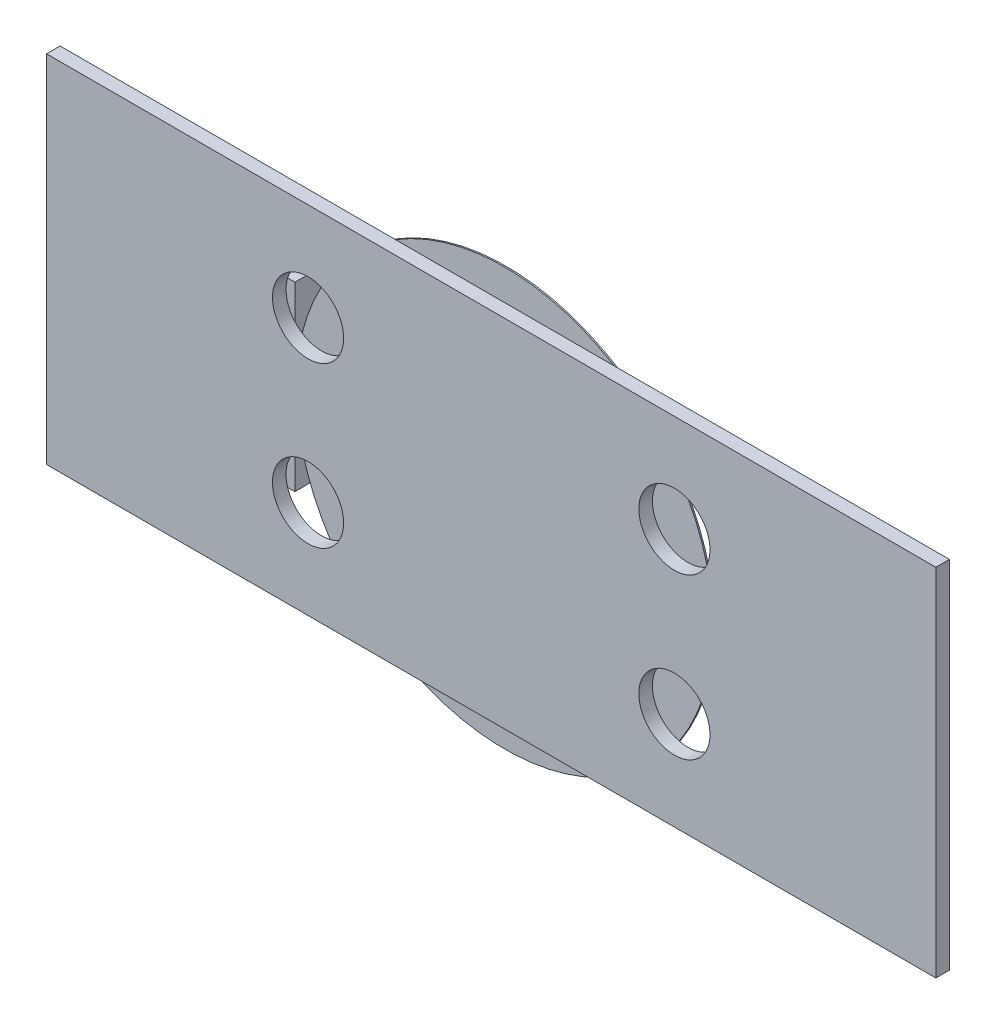
ISO-10303-21;
HEADER;
FILE_DESCRIPTION(('STEP AP214'),'2;1');
FILE_NAME('part.step','',(''),(''),'','','');
FILE_SCHEMA(('AUTOMOTIVE_DESIGN { 1 0 10303 214 1 1 1 1 }'));
ENDSEC;
DATA;
#1=APPLICATION_CONTEXT('core data for automotive mechanical design processes');
#2=APPLICATION_PROTOCOL_DEFINITION('international standard','automotive_design',2000,#1);
#3=PRODUCT_CONTEXT('',#1,'mechanical');
#4=PRODUCT('Part','Part','',(#3));
#5=PRODUCT_RELATED_PRODUCT_CATEGORY('part','',(#4));
#6=PRODUCT_DEFINITION_FORMATION('','',#4);
#7=PRODUCT_DEFINITION_CONTEXT('part definition',#1,'design');
#8=PRODUCT_DEFINITION('design','',#6,#7);
#9=PRODUCT_DEFINITION_SHAPE('','',#8);
#10=(LENGTH_UNIT() NAMED_UNIT(*) SI_UNIT(.MILLI.,.METRE.));
#11=(NAMED_UNIT(*) PLANE_ANGLE_UNIT() SI_UNIT($,.RADIAN.));
#12=(NAMED_UNIT(*) SI_UNIT($,.STERADIAN.) SOLID_ANGLE_UNIT());
#13=UNCERTAINTY_MEASURE_WITH_UNIT(LENGTH_MEASURE(1.E-05),#10,'distance_accuracy_value','');
#14=(GEOMETRIC_REPRESENTATION_CONTEXT(3) GLOBAL_UNCERTAINTY_ASSIGNED_CONTEXT((#13)) GLOBAL_UNIT_ASSIGNED_CONTEXT((#10,
#11,#12)) REPRESENTATION_CONTEXT('',''));
#15=CARTESIAN_POINT('',(0.,0.,0.));
#16=DIRECTION('',(0.,0.,1.));
#17=DIRECTION('',(1.,0.,0.));
#18=AXIS2_PLACEMENT_3D('',#15,#16,#17);
#19=CARTESIAN_POINT('',(0.,0.,-1.381));
#20=DIRECTION('',(0.,0.,-1.));
#21=DIRECTION('',(0.,-1.,0.));
#22=AXIS2_PLACEMENT_3D('',#19,#20,#21);
#23=PLANE('',#22);
#24=DIRECTION('',(1.,0.,0.));
#25=VECTOR('',#24,1.);
#26=CARTESIAN_POINT('',(0.,5.,-1.381));
#27=LINE('',#26,#25);
#28=CARTESIAN_POINT('',(-12.5,5.,-1.381));
#29=VERTEX_POINT('',#28);
#30=CARTESIAN_POINT('',(-3.07327187212586,5.,-1.381));
#31=VERTEX_POINT('',#30);
#32=EDGE_CURVE('E447',#29,#31,#27,.T.);
#33=ORIENTED_EDGE('',*,*,#32,.T.);
#34=CARTESIAN_POINT('',(0.,0.,-1.381));
#35=DIRECTION('',(0.,0.,-1.));
#36=DIRECTION('',(0.,1.,0.));
#37=AXIS2_PLACEMENT_3D('',#34,#35,#36);
#38=CIRCLE('',#37,5.86898628384835);
#39=CARTESIAN_POINT('',(-4.9068058853269,3.21997764025176,-1.381));
#40=VERTEX_POINT('',#39);
#41=EDGE_CURVE('E326',#31,#40,#38,.F.);
#42=ORIENTED_EDGE('',*,*,#41,.T.);
#43=CARTESIAN_POINT('',(-5.15,2.25,-1.381));
#44=DIRECTION('',(0.,0.,-1.));
#45=DIRECTION('',(0.,-1.,0.));
#46=AXIS2_PLACEMENT_3D('',#43,#44,#45);
#47=CIRCLE('',#46,1.);
#48=CARTESIAN_POINT('',(-6.10393920141694,2.55,-1.381));
#49=VERTEX_POINT('',#48);
#50=EDGE_CURVE('E462',#49,#40,#47,.T.);
#51=ORIENTED_EDGE('',*,*,#50,.F.);
#52=DIRECTION('',(-1.,0.,0.));
#53=VECTOR('',#52,1.);
#54=CARTESIAN_POINT('',(-5.9,2.55,-1.381));
#55=LINE('',#54,#53);
#56=CARTESIAN_POINT('',(-11.,2.55,-1.381));
#57=VERTEX_POINT('',#56);
#58=EDGE_CURVE('E323',#49,#57,#55,.T.);
#59=ORIENTED_EDGE('',*,*,#58,.T.);
#60=DIRECTION('',(0.,-1.,0.));
#61=VECTOR('',#60,1.);
#62=CARTESIAN_POINT('',(-11.,2.55,-1.381));
#63=LINE('',#62,#61);
#64=CARTESIAN_POINT('',(-11.,-2.55,-1.381));
#65=VERTEX_POINT('',#64);
#66=EDGE_CURVE('E317',#57,#65,#63,.T.);
#67=ORIENTED_EDGE('',*,*,#66,.T.);
#68=DIRECTION('',(-1.,0.,0.));
#69=VECTOR('',#68,1.);
#70=CARTESIAN_POINT('',(-5.9,-2.55,-1.381));
#71=LINE('',#70,#69);
#72=CARTESIAN_POINT('',(-6.10393920141695,-2.55,-1.381));
#73=VERTEX_POINT('',#72);
#74=EDGE_CURVE('E537',#73,#65,#71,.T.);
#75=ORIENTED_EDGE('',*,*,#74,.F.);
#76=CARTESIAN_POINT('',(-5.15,-2.25,-1.381));
#77=DIRECTION('',(0.,0.,1.));
#78=DIRECTION('',(0.,1.,0.));
#79=AXIS2_PLACEMENT_3D('',#76,#77,#78);
#80=CIRCLE('',#79,1.);
#81=CARTESIAN_POINT('',(-4.9068058853269,-3.21997764025176,-1.381));
#82=VERTEX_POINT('',#81);
#83=EDGE_CURVE('E266',#73,#82,#80,.T.);
#84=ORIENTED_EDGE('',*,*,#83,.T.);
#85=CARTESIAN_POINT('',(-3.07327187212586,-5.,-1.381));
#86=VERTEX_POINT('',#85);
#87=EDGE_CURVE('E316',#82,#86,#38,.F.);
#88=ORIENTED_EDGE('',*,*,#87,.T.);
#89=DIRECTION('',(1.,0.,0.));
#90=VECTOR('',#89,1.);
#91=CARTESIAN_POINT('',(0.,-5.,-1.381));
#92=LINE('',#91,#90);
#93=CARTESIAN_POINT('',(-12.5,-5.,-1.381));
#94=VERTEX_POINT('',#93);
#95=EDGE_CURVE('E467',#94,#86,#92,.T.);
#96=ORIENTED_EDGE('',*,*,#95,.F.);
#97=DIRECTION('',(0.,-1.,0.));
#98=VECTOR('',#97,1.);
#99=CARTESIAN_POINT('',(-12.5,0.,-1.381));
#100=LINE('',#99,#98);
#101=EDGE_CURVE('E246',#29,#94,#100,.T.);
#102=ORIENTED_EDGE('',*,*,#101,.F.);
#103=EDGE_LOOP('',(#33,#42,#51,#59,#67,#75,#84,#88,#96,#102));
#104=FACE_BOUND('',#103,.T.);
#105=ADVANCED_FACE('F41',(#104),#23,.T.);
#106=CARTESIAN_POINT('',(3.07327187212586,5.,-1.381));
#107=VERTEX_POINT('',#106);
#108=CARTESIAN_POINT('',(12.5,5.,-1.381));
#109=VERTEX_POINT('',#108);
#110=EDGE_CURVE('E320',#107,#109,#27,.T.);
#111=ORIENTED_EDGE('',*,*,#110,.T.);
#112=DIRECTION('',(0.,-1.,0.));
#113=VECTOR('',#112,1.);
#114=CARTESIAN_POINT('',(12.5,0.,-1.381));
#115=LINE('',#114,#113);
#116=CARTESIAN_POINT('',(12.5,-5.,-1.381));
#117=VERTEX_POINT('',#116);
#118=EDGE_CURVE('E489',#109,#117,#115,.T.);
#119=ORIENTED_EDGE('',*,*,#118,.T.);
#120=CARTESIAN_POINT('',(3.07327187212586,-5.,-1.381));
#121=VERTEX_POINT('',#120);
#122=EDGE_CURVE('E238',#121,#117,#92,.T.);
#123=ORIENTED_EDGE('',*,*,#122,.F.);
#124=CARTESIAN_POINT('',(4.9068058853269,-3.21997764025176,-1.381));
#125=VERTEX_POINT('',#124);
#126=EDGE_CURVE('E491',#121,#125,#38,.F.);
#127=ORIENTED_EDGE('',*,*,#126,.T.);
#128=CARTESIAN_POINT('',(5.15,-2.25,-1.381));
#129=DIRECTION('',(0.,0.,-1.));
#130=DIRECTION('',(0.,1.,0.));
#131=AXIS2_PLACEMENT_3D('',#128,#129,#130);
#132=CIRCLE('',#131,1.);
#133=CARTESIAN_POINT('',(6.10393920141697,-2.54999999999991,-1.381));
#134=VERTEX_POINT('',#133);
#135=EDGE_CURVE('E482',#134,#125,#132,.T.);
#136=ORIENTED_EDGE('',*,*,#135,.F.);
#137=DIRECTION('',(1.,0.,0.));
#138=VECTOR('',#137,1.);
#139=CARTESIAN_POINT('',(5.90000000000004,-2.54999999999991,-1.381));
#140=LINE('',#139,#138);
#141=CARTESIAN_POINT('',(11.,-2.54999999999984,-1.381));
#142=VERTEX_POINT('',#141);
#143=EDGE_CURVE('E401',#134,#142,#140,.T.);
#144=ORIENTED_EDGE('',*,*,#143,.T.);
#145=DIRECTION('',(0.,1.,0.));
#146=VECTOR('',#145,1.);
#147=CARTESIAN_POINT('',(11.,-2.54999999999984,-1.381));
#148=LINE('',#147,#146);
#149=CARTESIAN_POINT('',(11.,2.55000000000016,-1.381));
#150=VERTEX_POINT('',#149);
#151=EDGE_CURVE('E397',#142,#150,#148,.T.);
#152=ORIENTED_EDGE('',*,*,#151,.T.);
#153=DIRECTION('',(1.,0.,0.));
#154=VECTOR('',#153,1.);
#155=CARTESIAN_POINT('',(5.89999999999996,2.55000000000009,-1.381));
#156=LINE('',#155,#154);
#157=CARTESIAN_POINT('',(6.10393920141692,2.55000000000009,-1.381));
#158=VERTEX_POINT('',#157);
#159=EDGE_CURVE('E387',#158,#150,#156,.T.);
#160=ORIENTED_EDGE('',*,*,#159,.F.);
#161=CARTESIAN_POINT('',(5.15,2.25,-1.381));
#162=DIRECTION('',(0.,0.,1.));
#163=DIRECTION('',(0.,-1.,0.));
#164=AXIS2_PLACEMENT_3D('',#161,#162,#163);
#165=CIRCLE('',#164,1.);
#166=CARTESIAN_POINT('',(4.9068058853269,3.21997764025176,-1.381));
#167=VERTEX_POINT('',#166);
#168=EDGE_CURVE('E400',#158,#167,#165,.T.);
#169=ORIENTED_EDGE('',*,*,#168,.T.);
#170=EDGE_CURVE('E499',#167,#107,#38,.F.);
#171=ORIENTED_EDGE('',*,*,#170,.T.);
#172=EDGE_LOOP('',(#111,#119,#123,#127,#136,#144,#152,#160,#169,#171));
#173=FACE_BOUND('',#172,.T.);
#174=ADVANCED_FACE('F685',(#173),#23,.T.);
#175=CARTESIAN_POINT('',(-5.69647098660598,1.41252196399076,-1.381));
#176=VERTEX_POINT('',#175);
#177=CARTESIAN_POINT('',(-5.86365926704477,0.25,-1.381));
#178=VERTEX_POINT('',#177);
#179=EDGE_CURVE('E308',#176,#178,#38,.F.);
#180=ORIENTED_EDGE('',*,*,#179,.T.);
#181=DIRECTION('',(-1.,0.,0.));
#182=VECTOR('',#181,1.);
#183=CARTESIAN_POINT('',(0.,0.25,-1.381));
#184=LINE('',#183,#182);
#185=CARTESIAN_POINT('',(-5.9,0.25,-1.381));
#186=VERTEX_POINT('',#185);
#187=EDGE_CURVE('E305',#178,#186,#184,.T.);
#188=ORIENTED_EDGE('',*,*,#187,.T.);
#189=DIRECTION('',(0.,-1.,0.));
#190=VECTOR('',#189,1.);
#191=CARTESIAN_POINT('',(-5.9,2.55,-1.381));
#192=LINE('',#191,#190);
#193=CARTESIAN_POINT('',(-5.9,1.58856217223385,-1.381));
#194=VERTEX_POINT('',#193);
#195=EDGE_CURVE('E283',#194,#186,#192,.T.);
#196=ORIENTED_EDGE('',*,*,#195,.F.);
#197=EDGE_CURVE('E457',#176,#194,#47,.T.);
#198=ORIENTED_EDGE('',*,*,#197,.F.);
#199=EDGE_LOOP('',(#180,#188,#196,#198));
#200=FACE_BOUND('',#199,.T.);
#201=ADVANCED_FACE('F690',(#200),#23,.T.);
#202=CARTESIAN_POINT('',(-5.69647098660598,-1.41252196399076,-1.381));
#203=VERTEX_POINT('',#202);
#204=CARTESIAN_POINT('',(-5.9,-1.58856217223385,-1.381));
#205=VERTEX_POINT('',#204);
#206=EDGE_CURVE('E295',#203,#205,#80,.T.);
#207=ORIENTED_EDGE('',*,*,#206,.T.);
#208=CARTESIAN_POINT('',(-5.9,-0.25,-1.381));
#209=VERTEX_POINT('',#208);
#210=EDGE_CURVE('E281',#209,#205,#192,.T.);
#211=ORIENTED_EDGE('',*,*,#210,.F.);
#212=DIRECTION('',(-1.,0.,0.));
#213=VECTOR('',#212,1.);
#214=CARTESIAN_POINT('',(0.,-0.25,-1.381));
#215=LINE('',#214,#213);
#216=CARTESIAN_POINT('',(-5.86365926704477,-0.25,-1.381));
#217=VERTEX_POINT('',#216);
#218=EDGE_CURVE('E354',#217,#209,#215,.T.);
#219=ORIENTED_EDGE('',*,*,#218,.F.);
#220=EDGE_CURVE('E303',#217,#203,#38,.F.);
#221=ORIENTED_EDGE('',*,*,#220,.T.);
#222=EDGE_LOOP('',(#207,#211,#219,#221));
#223=FACE_BOUND('',#222,.T.);
#224=ADVANCED_FACE('F301',(#223),#23,.T.);
#225=CARTESIAN_POINT('',(5.69647098660598,1.41252196399076,-1.381));
#226=VERTEX_POINT('',#225);
#227=CARTESIAN_POINT('',(5.89999999999997,1.58856217223382,-1.381));
#228=VERTEX_POINT('',#227);
#229=EDGE_CURVE('E306',#226,#228,#165,.T.);
#230=ORIENTED_EDGE('',*,*,#229,.T.);
#231=DIRECTION('',(0.,1.,0.));
#232=VECTOR('',#231,1.);
#233=CARTESIAN_POINT('',(5.90000000000004,-2.54999999999991,-1.381));
#234=LINE('',#233,#232);
#235=CARTESIAN_POINT('',(5.9,0.250000000000088,-1.381));
#236=VERTEX_POINT('',#235);
#237=EDGE_CURVE('E358',#236,#228,#234,.T.);
#238=ORIENTED_EDGE('',*,*,#237,.F.);
#239=DIRECTION('',(1.,0.,0.));
#240=VECTOR('',#239,1.);
#241=CARTESIAN_POINT('',(0.,0.25,-1.381));
#242=LINE('',#241,#240);
#243=CARTESIAN_POINT('',(5.86365926704477,0.250000000000088,-1.381));
#244=VERTEX_POINT('',#243);
#245=EDGE_CURVE('E417',#244,#236,#242,.T.);
#246=ORIENTED_EDGE('',*,*,#245,.F.);
#247=EDGE_CURVE('E309',#244,#226,#38,.F.);
#248=ORIENTED_EDGE('',*,*,#247,.T.);
#249=EDGE_LOOP('',(#230,#238,#246,#248));
#250=FACE_BOUND('',#249,.T.);
#251=ADVANCED_FACE('F692',(#250),#23,.T.);
#252=CARTESIAN_POINT('',(5.69647098660598,-1.41252196399076,-1.381));
#253=VERTEX_POINT('',#252);
#254=CARTESIAN_POINT('',(5.86365926704477,-0.249999999999912,-1.381));
#255=VERTEX_POINT('',#254);
#256=EDGE_CURVE('E432',#253,#255,#38,.F.);
#257=ORIENTED_EDGE('',*,*,#256,.T.);
#258=DIRECTION('',(1.,0.,0.));
#259=VECTOR('',#258,1.);
#260=CARTESIAN_POINT('',(0.,-0.25,-1.381));
#261=LINE('',#260,#259);
#262=CARTESIAN_POINT('',(5.9,-0.249999999999912,-1.381));
#263=VERTEX_POINT('',#262);
#264=EDGE_CURVE('E429',#255,#263,#261,.T.);
#265=ORIENTED_EDGE('',*,*,#264,.T.);
#266=CARTESIAN_POINT('',(5.90000000000002,-1.58856217223388,-1.381));
#267=VERTEX_POINT('',#266);
#268=EDGE_CURVE('E394',#267,#263,#234,.T.);
#269=ORIENTED_EDGE('',*,*,#268,.F.);
#270=EDGE_CURVE('E45',#253,#267,#132,.T.);
#271=ORIENTED_EDGE('',*,*,#270,.F.);
#272=EDGE_LOOP('',(#257,#265,#269,#271));
#273=FACE_BOUND('',#272,.T.);
#274=ADVANCED_FACE('F686',(#273),#23,.T.);
#275=CARTESIAN_POINT('',(0.,0.,-1.380988));
#276=DIRECTION('',(0.,0.,1.));
#277=DIRECTION('',(0.,1.,0.));
#278=AXIS2_PLACEMENT_3D('',#275,#276,#277);
#279=ELLIPSE('',#278,5.86898628384835,5.86898628384834);
#280=DIRECTION('',(0.,0.,-1.));
#281=VECTOR('',#280,1.);
#282=SURFACE_OF_LINEAR_EXTRUSION('',#279,#281);
#283=CARTESIAN_POINT('',(0.,0.,-1.421));
#284=DIRECTION('',(0.,0.,1.));
#285=DIRECTION('',(0.,1.,0.));
#286=AXIS2_PLACEMENT_3D('',#283,#284,#285);
#287=ELLIPSE('',#286,5.86898628384835,5.86898628384834);
#288=CARTESIAN_POINT('',(5.86365926704476,0.250000000000088,-1.421));
#289=VERTEX_POINT('',#288);
#290=CARTESIAN_POINT('',(-5.86365926704477,0.25,-1.421));
#291=VERTEX_POINT('',#290);
#292=EDGE_CURVE('E359',#289,#291,#287,.T.);
#293=ORIENTED_EDGE('',*,*,#292,.T.);
#294=DIRECTION('',(0.,0.,-1.));
#295=VECTOR('',#294,1.);
#296=CARTESIAN_POINT('',(-5.86365926704477,0.25,-1.401));
#297=LINE('',#296,#295);
#298=EDGE_CURVE('E355',#291,#178,#297,.F.);
#299=ORIENTED_EDGE('',*,*,#298,.T.);
#300=ORIENTED_EDGE('',*,*,#179,.F.);
#301=EDGE_CURVE('E333',#40,#176,#38,.F.);
#302=ORIENTED_EDGE('',*,*,#301,.F.);
#303=ORIENTED_EDGE('',*,*,#41,.F.);
#304=EDGE_CURVE('E493',#107,#31,#38,.F.);
#305=ORIENTED_EDGE('',*,*,#304,.F.);
#306=ORIENTED_EDGE('',*,*,#170,.F.);
#307=EDGE_CURVE('E495',#226,#167,#38,.F.);
#308=ORIENTED_EDGE('',*,*,#307,.F.);
#309=ORIENTED_EDGE('',*,*,#247,.F.);
#310=DIRECTION('',(0.,0.,-1.));
#311=VECTOR('',#310,1.);
#312=CARTESIAN_POINT('',(5.86365926704476,0.250000000000088,-1.401));
#313=LINE('',#312,#311);
#314=EDGE_CURVE('E383',#289,#244,#313,.F.);
#315=ORIENTED_EDGE('',*,*,#314,.F.);
#316=EDGE_LOOP('',(#293,#299,#300,#302,#303,#305,#306,#308,#309,#315));
#317=FACE_BOUND('',#316,.T.);
#318=ADVANCED_FACE('F572',(#317),#282,.F.);
#319=CARTESIAN_POINT('',(5.90000000000004,-2.54999999999991,-2.381));
#320=DIRECTION('',(1.,0.,0.));
#321=DIRECTION('',(0.,-1.,0.));
#322=AXIS2_PLACEMENT_3D('',#319,#320,#321);
#323=PLANE('',#322);
#324=ORIENTED_EDGE('',*,*,#237,.T.);
#325=CARTESIAN_POINT('',(5.89999999999996,2.55000000000009,-1.381));
#326=VERTEX_POINT('',#325);
#327=EDGE_CURVE('E392',#228,#326,#234,.T.);
#328=ORIENTED_EDGE('',*,*,#327,.T.);
#329=DIRECTION('',(0.,0.,1.));
#330=VECTOR('',#329,1.);
#331=CARTESIAN_POINT('',(5.89999999999996,2.55000000000009,-2.381));
#332=LINE('',#331,#330);
#333=CARTESIAN_POINT('',(5.89999999999996,2.55000000000009,-2.381));
#334=VERTEX_POINT('',#333);
#335=EDGE_CURVE('E385',#334,#326,#332,.T.);
#336=ORIENTED_EDGE('',*,*,#335,.F.);
#337=DIRECTION('',(0.,1.,0.));
#338=VECTOR('',#337,1.);
#339=CARTESIAN_POINT('',(5.90000000000004,-2.54999999999991,-2.381));
#340=LINE('',#339,#338);
#341=CARTESIAN_POINT('',(5.90000000000004,-2.54999999999991,-2.381));
#342=VERTEX_POINT('',#341);
#343=EDGE_CURVE('E405',#342,#334,#340,.T.);
#344=ORIENTED_EDGE('',*,*,#343,.F.);
#345=DIRECTION('',(0.,0.,1.));
#346=VECTOR('',#345,1.);
#347=CARTESIAN_POINT('',(5.90000000000004,-2.54999999999991,-2.381));
#348=LINE('',#347,#346);
#349=CARTESIAN_POINT('',(5.90000000000004,-2.54999999999991,-1.381));
#350=VERTEX_POINT('',#349);
#351=EDGE_CURVE('E388',#342,#350,#348,.T.);
#352=ORIENTED_EDGE('',*,*,#351,.T.);
#353=EDGE_CURVE('E391',#350,#267,#234,.T.);
#354=ORIENTED_EDGE('',*,*,#353,.T.);
#355=ORIENTED_EDGE('',*,*,#268,.T.);
#356=DIRECTION('',(0.,0.,1.));
#357=VECTOR('',#356,1.);
#358=CARTESIAN_POINT('',(5.9,-0.249999999999912,-1.421));
#359=LINE('',#358,#357);
#360=CARTESIAN_POINT('',(5.9,-0.25,-1.421));
#361=VERTEX_POINT('',#360);
#362=EDGE_CURVE('E424',#361,#263,#359,.T.);
#363=ORIENTED_EDGE('',*,*,#362,.F.);
#364=DIRECTION('',(0.,1.,0.));
#365=VECTOR('',#364,1.);
#366=CARTESIAN_POINT('',(5.9,-0.249999999999912,-1.421));
#367=LINE('',#366,#365);
#368=CARTESIAN_POINT('',(5.9,0.250000000000088,-1.421));
#369=VERTEX_POINT('',#368);
#370=EDGE_CURVE('E423',#361,#369,#367,.T.);
#371=ORIENTED_EDGE('',*,*,#370,.T.);
#372=DIRECTION('',(0.,0.,1.));
#373=VECTOR('',#372,1.);
#374=CARTESIAN_POINT('',(5.9,0.250000000000088,-1.421));
#375=LINE('',#374,#373);
#376=EDGE_CURVE('E421',#369,#236,#375,.T.);
#377=ORIENTED_EDGE('',*,*,#376,.T.);
#378=EDGE_LOOP('',(#324,#328,#336,#344,#352,#354,#355,#363,#371,#377));
#379=FACE_BOUND('',#378,.T.);
#380=ADVANCED_FACE('F570',(#379),#323,.F.);
#381=DIRECTION('',(0.,0.,-1.));
#382=VECTOR('',#381,1.);
#383=CARTESIAN_POINT('',(5.86365926704477,-0.249999999999912,-1.401));
#384=LINE('',#383,#382);
#385=CARTESIAN_POINT('',(5.86365926704477,-0.249999999999912,-1.421));
#386=VERTEX_POINT('',#385);
#387=EDGE_CURVE('E418',#386,#255,#384,.F.);
#388=ORIENTED_EDGE('',*,*,#387,.T.);
#389=ORIENTED_EDGE('',*,*,#256,.F.);
#390=EDGE_CURVE('E406',#125,#253,#38,.F.);
#391=ORIENTED_EDGE('',*,*,#390,.F.);
#392=ORIENTED_EDGE('',*,*,#126,.F.);
#393=EDGE_CURVE('E321',#86,#121,#38,.F.);
#394=ORIENTED_EDGE('',*,*,#393,.F.);
#395=ORIENTED_EDGE('',*,*,#87,.F.);
#396=EDGE_CURVE('E297',#203,#82,#38,.F.);
#397=ORIENTED_EDGE('',*,*,#396,.F.);
#398=ORIENTED_EDGE('',*,*,#220,.F.);
#399=DIRECTION('',(0.,0.,-1.));
#400=VECTOR('',#399,1.);
#401=CARTESIAN_POINT('',(-5.86365926704477,-0.25,-1.401));
#402=LINE('',#401,#400);
#403=CARTESIAN_POINT('',(-5.86365926704477,-0.25,-1.421));
#404=VERTEX_POINT('',#403);
#405=EDGE_CURVE('E351',#404,#217,#402,.F.);
#406=ORIENTED_EDGE('',*,*,#405,.F.);
#407=EDGE_CURVE('E292',#404,#386,#287,.T.);
#408=ORIENTED_EDGE('',*,*,#407,.T.);
#409=EDGE_LOOP('',(#388,#389,#391,#392,#394,#395,#397,#398,#406,#408));
#410=FACE_BOUND('',#409,.T.);
#411=ADVANCED_FACE('F566',(#410),#282,.F.);
#412=CARTESIAN_POINT('',(-5.9,2.55,-2.381));
#413=DIRECTION('',(-1.,0.,0.));
#414=DIRECTION('',(0.,1.,0.));
#415=AXIS2_PLACEMENT_3D('',#412,#413,#414);
#416=PLANE('',#415);
#417=ORIENTED_EDGE('',*,*,#210,.T.);
#418=CARTESIAN_POINT('',(-5.9,-2.55,-1.381));
#419=VERTEX_POINT('',#418);
#420=EDGE_CURVE('E273',#205,#419,#192,.T.);
#421=ORIENTED_EDGE('',*,*,#420,.T.);
#422=DIRECTION('',(0.,0.,1.));
#423=VECTOR('',#422,1.);
#424=CARTESIAN_POINT('',(-5.9,-2.55,-2.381));
#425=LINE('',#424,#423);
#426=CARTESIAN_POINT('',(-5.9,-2.55,-2.381));
#427=VERTEX_POINT('',#426);
#428=EDGE_CURVE('E345',#427,#419,#425,.T.);
#429=ORIENTED_EDGE('',*,*,#428,.F.);
#430=DIRECTION('',(0.,-1.,0.));
#431=VECTOR('',#430,1.);
#432=CARTESIAN_POINT('',(-5.9,2.55,-2.381));
#433=LINE('',#432,#431);
#434=CARTESIAN_POINT('',(-5.9,2.55,-2.381));
#435=VERTEX_POINT('',#434);
#436=EDGE_CURVE('E334',#435,#427,#433,.T.);
#437=ORIENTED_EDGE('',*,*,#436,.F.);
#438=DIRECTION('',(0.,0.,1.));
#439=VECTOR('',#438,1.);
#440=CARTESIAN_POINT('',(-5.9,2.55,-2.381));
#441=LINE('',#440,#439);
#442=CARTESIAN_POINT('',(-5.9,2.55,-1.381));
#443=VERTEX_POINT('',#442);
#444=EDGE_CURVE('E280',#435,#443,#441,.T.);
#445=ORIENTED_EDGE('',*,*,#444,.T.);
#446=EDGE_CURVE('E293',#443,#194,#192,.T.);
#447=ORIENTED_EDGE('',*,*,#446,.T.);
#448=ORIENTED_EDGE('',*,*,#195,.T.);
#449=DIRECTION('',(0.,0.,1.));
#450=VECTOR('',#449,1.);
#451=CARTESIAN_POINT('',(-5.9,0.25,-1.421));
#452=LINE('',#451,#450);
#453=CARTESIAN_POINT('',(-5.9,0.25,-1.421));
#454=VERTEX_POINT('',#453);
#455=EDGE_CURVE('E363',#454,#186,#452,.T.);
#456=ORIENTED_EDGE('',*,*,#455,.F.);
#457=DIRECTION('',(0.,-1.,0.));
#458=VECTOR('',#457,1.);
#459=CARTESIAN_POINT('',(-5.9,0.25,-1.421));
#460=LINE('',#459,#458);
#461=CARTESIAN_POINT('',(-5.9,-0.25,-1.421));
#462=VERTEX_POINT('',#461);
#463=EDGE_CURVE('E362',#454,#462,#460,.T.);
#464=ORIENTED_EDGE('',*,*,#463,.T.);
#465=DIRECTION('',(0.,0.,1.));
#466=VECTOR('',#465,1.);
#467=CARTESIAN_POINT('',(-5.9,-0.25,-1.421));
#468=LINE('',#467,#466);
#469=EDGE_CURVE('E288',#462,#209,#468,.T.);
#470=ORIENTED_EDGE('',*,*,#469,.T.);
#471=EDGE_LOOP('',(#417,#421,#429,#437,#445,#447,#448,#456,#464,#470));
#472=FACE_BOUND('',#471,.T.);
#473=ADVANCED_FACE('F285',(#472),#416,.F.);
#474=CARTESIAN_POINT('',(-3.15,0.,-2.381));
#475=DIRECTION('',(1.,0.,0.));
#476=DIRECTION('',(0.,-1.,0.));
#477=AXIS2_PLACEMENT_3D('',#474,#475,#476);
#478=PLANE('',#477);
#479=DIRECTION('',(0.,0.,1.));
#480=VECTOR('',#479,1.);
#481=CARTESIAN_POINT('',(-3.15,3.15,-2.381));
#482=LINE('',#481,#480);
#483=CARTESIAN_POINT('',(-3.15,3.15,-2.381));
#484=VERTEX_POINT('',#483);
#485=CARTESIAN_POINT('',(-3.15,3.15,-1.421));
#486=VERTEX_POINT('',#485);
#487=EDGE_CURVE('E375',#484,#486,#482,.T.);
#488=ORIENTED_EDGE('',*,*,#487,.F.);
#489=DIRECTION('',(0.,1.,0.));
#490=VECTOR('',#489,1.);
#491=CARTESIAN_POINT('',(-3.15,0.,-2.381));
#492=LINE('',#491,#490);
#493=CARTESIAN_POINT('',(-3.15,-3.15,-2.381));
#494=VERTEX_POINT('',#493);
#495=EDGE_CURVE('E51',#494,#484,#492,.T.);
#496=ORIENTED_EDGE('',*,*,#495,.F.);
#497=DIRECTION('',(0.,0.,1.));
#498=VECTOR('',#497,1.);
#499=CARTESIAN_POINT('',(-3.15,-3.15,-2.381));
#500=LINE('',#499,#498);
#501=CARTESIAN_POINT('',(-3.15,-3.15,-1.421));
#502=VERTEX_POINT('',#501);
#503=EDGE_CURVE('E361',#494,#502,#500,.T.);
#504=ORIENTED_EDGE('',*,*,#503,.T.);
#505=DIRECTION('',(0.,1.,0.));
#506=VECTOR('',#505,1.);
#507=CARTESIAN_POINT('',(-3.15,0.,-1.421));
#508=LINE('',#507,#506);
#509=EDGE_CURVE('E549',#502,#486,#508,.T.);
#510=ORIENTED_EDGE('',*,*,#509,.T.);
#511=EDGE_LOOP('',(#488,#496,#504,#510));
#512=FACE_BOUND('',#511,.T.);
#513=ADVANCED_FACE('F600',(#512),#478,.F.);
#514=CARTESIAN_POINT('',(0.,3.15,-2.381));
#515=DIRECTION('',(0.,1.,0.));
#516=DIRECTION('',(1.,0.,0.));
#517=AXIS2_PLACEMENT_3D('',#514,#515,#516);
#518=PLANE('',#517);
#519=DIRECTION('',(1.,0.,0.));
#520=VECTOR('',#519,1.);
#521=CARTESIAN_POINT('',(0.,3.15,-1.421));
#522=LINE('',#521,#520);
#523=CARTESIAN_POINT('',(3.15,3.15,-1.421));
#524=VERTEX_POINT('',#523);
#525=EDGE_CURVE('E558',#486,#524,#522,.T.);
#526=ORIENTED_EDGE('',*,*,#525,.T.);
#527=DIRECTION('',(0.,0.,1.));
#528=VECTOR('',#527,1.);
#529=CARTESIAN_POINT('',(3.15,3.15,-2.381));
#530=LINE('',#529,#528);
#531=CARTESIAN_POINT('',(3.15,3.15,-2.381));
#532=VERTEX_POINT('',#531);
#533=EDGE_CURVE('E551',#532,#524,#530,.T.);
#534=ORIENTED_EDGE('',*,*,#533,.F.);
#535=DIRECTION('',(-1.,0.,0.));
#536=VECTOR('',#535,1.);
#537=CARTESIAN_POINT('',(0.,3.15,-2.381));
#538=LINE('',#537,#536);
#539=EDGE_CURVE('E561',#532,#484,#538,.T.);
#540=ORIENTED_EDGE('',*,*,#539,.T.);
#541=ORIENTED_EDGE('',*,*,#487,.T.);
#542=EDGE_LOOP('',(#526,#534,#540,#541));
#543=FACE_BOUND('',#542,.T.);
#544=ADVANCED_FACE('F578',(#543),#518,.T.);
#545=CARTESIAN_POINT('',(0.,0.,-1.421));
#546=DIRECTION('',(0.,0.,1.));
#547=DIRECTION('',(0.,1.,0.));
#548=AXIS2_PLACEMENT_3D('',#545,#546,#547);
#549=PLANE('',#548);
#550=ORIENTED_EDGE('',*,*,#407,.F.);
#551=DIRECTION('',(-1.,0.,0.));
#552=VECTOR('',#551,1.);
#553=CARTESIAN_POINT('',(0.,-0.25,-1.421));
#554=LINE('',#553,#552);
#555=EDGE_CURVE('E372',#404,#462,#554,.T.);
#556=ORIENTED_EDGE('',*,*,#555,.T.);
#557=ORIENTED_EDGE('',*,*,#463,.F.);
#558=DIRECTION('',(-1.,0.,0.));
#559=VECTOR('',#558,1.);
#560=CARTESIAN_POINT('',(0.,0.25,-1.421));
#561=LINE('',#560,#559);
#562=EDGE_CURVE('E366',#291,#454,#561,.T.);
#563=ORIENTED_EDGE('',*,*,#562,.F.);
#564=ORIENTED_EDGE('',*,*,#292,.F.);
#565=DIRECTION('',(1.,0.,0.));
#566=VECTOR('',#565,1.);
#567=CARTESIAN_POINT('',(0.,0.25,-1.421));
#568=LINE('',#567,#566);
#569=EDGE_CURVE('E374',#289,#369,#568,.T.);
#570=ORIENTED_EDGE('',*,*,#569,.T.);
#571=ORIENTED_EDGE('',*,*,#370,.F.);
#572=DIRECTION('',(1.,0.,0.));
#573=VECTOR('',#572,1.);
#574=CARTESIAN_POINT('',(0.,-0.25,-1.421));
#575=LINE('',#574,#573);
#576=EDGE_CURVE('E428',#386,#361,#575,.T.);
#577=ORIENTED_EDGE('',*,*,#576,.F.);
#578=EDGE_LOOP('',(#550,#556,#557,#563,#564,#570,#571,#577));
#579=FACE_BOUND('',#578,.T.);
#580=ORIENTED_EDGE('',*,*,#525,.F.);
#581=ORIENTED_EDGE('',*,*,#509,.F.);
#582=DIRECTION('',(1.,0.,0.));
#583=VECTOR('',#582,1.);
#584=CARTESIAN_POINT('',(0.,-3.15,-1.421));
#585=LINE('',#584,#583);
#586=CARTESIAN_POINT('',(3.15,-3.15,-1.421));
#587=VERTEX_POINT('',#586);
#588=EDGE_CURVE('E440',#502,#587,#585,.T.);
#589=ORIENTED_EDGE('',*,*,#588,.T.);
#590=DIRECTION('',(0.,1.,0.));
#591=VECTOR('',#590,1.);
#592=CARTESIAN_POINT('',(3.15,0.,-1.421));
#593=LINE('',#592,#591);
#594=EDGE_CURVE('E545',#587,#524,#593,.T.);
#595=ORIENTED_EDGE('',*,*,#594,.T.);
#596=EDGE_LOOP('',(#580,#581,#589,#595));
#597=FACE_BOUND('',#596,.T.);
#598=ADVANCED_FACE('F574',(#579,#597),#549,.F.);
#599=CARTESIAN_POINT('',(3.15,0.,-2.381));
#600=DIRECTION('',(-1.,0.,0.));
#601=DIRECTION('',(0.,-1.,0.));
#602=AXIS2_PLACEMENT_3D('',#599,#600,#601);
#603=PLANE('',#602);
#604=ORIENTED_EDGE('',*,*,#533,.T.);
#605=ORIENTED_EDGE('',*,*,#594,.F.);
#606=DIRECTION('',(0.,0.,1.));
#607=VECTOR('',#606,1.);
#608=CARTESIAN_POINT('',(3.15,-3.15,-2.381));
#609=LINE('',#608,#607);
#610=CARTESIAN_POINT('',(3.15,-3.15,-2.381));
#611=VERTEX_POINT('',#610);
#612=EDGE_CURVE('E350',#611,#587,#609,.T.);
#613=ORIENTED_EDGE('',*,*,#612,.F.);
#614=DIRECTION('',(0.,1.,0.));
#615=VECTOR('',#614,1.);
#616=CARTESIAN_POINT('',(3.15,0.,-2.381));
#617=LINE('',#616,#615);
#618=EDGE_CURVE('E543',#611,#532,#617,.T.);
#619=ORIENTED_EDGE('',*,*,#618,.T.);
#620=EDGE_LOOP('',(#604,#605,#613,#619));
#621=FACE_BOUND('',#620,.T.);
#622=ADVANCED_FACE('F577',(#621),#603,.F.);
#623=CARTESIAN_POINT('',(0.,-3.15,-2.381));
#624=DIRECTION('',(0.,-1.,0.));
#625=DIRECTION('',(1.,0.,0.));
#626=AXIS2_PLACEMENT_3D('',#623,#624,#625);
#627=PLANE('',#626);
#628=ORIENTED_EDGE('',*,*,#588,.F.);
#629=ORIENTED_EDGE('',*,*,#503,.F.);
#630=DIRECTION('',(-1.,0.,0.));
#631=VECTOR('',#630,1.);
#632=CARTESIAN_POINT('',(0.,-3.15,-2.381));
#633=LINE('',#632,#631);
#634=EDGE_CURVE('E11',#611,#494,#633,.T.);
#635=ORIENTED_EDGE('',*,*,#634,.F.);
#636=ORIENTED_EDGE('',*,*,#612,.T.);
#637=EDGE_LOOP('',(#628,#629,#635,#636));
#638=FACE_BOUND('',#637,.T.);
#639=ADVANCED_FACE('F582',(#638),#627,.T.);
#640=CARTESIAN_POINT('',(-5.9,2.55,-2.381));
#641=DIRECTION('',(0.,1.,0.));
#642=DIRECTION('',(1.,0.,0.));
#643=AXIS2_PLACEMENT_3D('',#640,#641,#642);
#644=PLANE('',#643);
#645=EDGE_CURVE('E328',#443,#49,#55,.T.);
#646=ORIENTED_EDGE('',*,*,#645,.F.);
#647=ORIENTED_EDGE('',*,*,#444,.F.);
#648=DIRECTION('',(-1.,0.,0.));
#649=VECTOR('',#648,1.);
#650=CARTESIAN_POINT('',(-5.9,2.55,-2.381));
#651=LINE('',#650,#649);
#652=CARTESIAN_POINT('',(-11.,2.55,-2.381));
#653=VERTEX_POINT('',#652);
#654=EDGE_CURVE('E346',#435,#653,#651,.T.);
#655=ORIENTED_EDGE('',*,*,#654,.T.);
#656=DIRECTION('',(0.,0.,1.));
#657=VECTOR('',#656,1.);
#658=CARTESIAN_POINT('',(-11.,2.55,-2.381));
#659=LINE('',#658,#657);
#660=EDGE_CURVE('E349',#653,#57,#659,.T.);
#661=ORIENTED_EDGE('',*,*,#660,.T.);
#662=ORIENTED_EDGE('',*,*,#58,.F.);
#663=EDGE_LOOP('',(#646,#647,#655,#661,#662));
#664=FACE_BOUND('',#663,.T.);
#665=ADVANCED_FACE('F530',(#664),#644,.T.);
#666=CARTESIAN_POINT('',(-5.9,-2.55,-2.381));
#667=DIRECTION('',(0.,1.,0.));
#668=DIRECTION('',(1.,0.,0.));
#669=AXIS2_PLACEMENT_3D('',#666,#667,#668);
#670=PLANE('',#669);
#671=EDGE_CURVE('E278',#419,#73,#71,.T.);
#672=ORIENTED_EDGE('',*,*,#671,.T.);
#673=ORIENTED_EDGE('',*,*,#74,.T.);
#674=DIRECTION('',(0.,0.,1.));
#675=VECTOR('',#674,1.);
#676=CARTESIAN_POINT('',(-11.,-2.55,-2.381));
#677=LINE('',#676,#675);
#678=CARTESIAN_POINT('',(-11.,-2.55,-2.381));
#679=VERTEX_POINT('',#678);
#680=EDGE_CURVE('E344',#679,#65,#677,.T.);
#681=ORIENTED_EDGE('',*,*,#680,.F.);
#682=DIRECTION('',(-1.,0.,0.));
#683=VECTOR('',#682,1.);
#684=CARTESIAN_POINT('',(-5.9,-2.55,-2.381));
#685=LINE('',#684,#683);
#686=EDGE_CURVE('E337',#427,#679,#685,.T.);
#687=ORIENTED_EDGE('',*,*,#686,.F.);
#688=ORIENTED_EDGE('',*,*,#428,.T.);
#689=EDGE_LOOP('',(#672,#673,#681,#687,#688));
#690=FACE_BOUND('',#689,.T.);
#691=ADVANCED_FACE('F589',(#690),#670,.F.);
#692=CARTESIAN_POINT('',(-11.,2.55,-2.381));
#693=DIRECTION('',(-1.,0.,0.));
#694=DIRECTION('',(0.,1.,0.));
#695=AXIS2_PLACEMENT_3D('',#692,#693,#694);
#696=PLANE('',#695);
#697=ORIENTED_EDGE('',*,*,#66,.F.);
#698=ORIENTED_EDGE('',*,*,#660,.F.);
#699=DIRECTION('',(0.,-1.,0.));
#700=VECTOR('',#699,1.);
#701=CARTESIAN_POINT('',(-11.,2.55,-2.381));
#702=LINE('',#701,#700);
#703=EDGE_CURVE('E341',#653,#679,#702,.T.);
#704=ORIENTED_EDGE('',*,*,#703,.T.);
#705=ORIENTED_EDGE('',*,*,#680,.T.);
#706=EDGE_LOOP('',(#697,#698,#704,#705));
#707=FACE_BOUND('',#706,.T.);
#708=ADVANCED_FACE('F590',(#707),#696,.T.);
#709=CARTESIAN_POINT('',(0.,-0.25,-1.421));
#710=DIRECTION('',(0.,1.,0.));
#711=DIRECTION('',(1.,0.,0.));
#712=AXIS2_PLACEMENT_3D('',#709,#710,#711);
#713=PLANE('',#712);
#714=ORIENTED_EDGE('',*,*,#555,.F.);
#715=ORIENTED_EDGE('',*,*,#405,.T.);
#716=ORIENTED_EDGE('',*,*,#218,.T.);
#717=ORIENTED_EDGE('',*,*,#469,.F.);
#718=EDGE_LOOP('',(#714,#715,#716,#717));
#719=FACE_BOUND('',#718,.T.);
#720=ADVANCED_FACE('F593',(#719),#713,.F.);
#721=CARTESIAN_POINT('',(0.,0.25,-1.421));
#722=DIRECTION('',(0.,1.,0.));
#723=DIRECTION('',(1.,0.,0.));
#724=AXIS2_PLACEMENT_3D('',#721,#722,#723);
#725=PLANE('',#724);
#726=ORIENTED_EDGE('',*,*,#298,.F.);
#727=ORIENTED_EDGE('',*,*,#562,.T.);
#728=ORIENTED_EDGE('',*,*,#455,.T.);
#729=ORIENTED_EDGE('',*,*,#187,.F.);
#730=EDGE_LOOP('',(#726,#727,#728,#729));
#731=FACE_BOUND('',#730,.T.);
#732=ADVANCED_FACE('F603',(#731),#725,.T.);
#733=CARTESIAN_POINT('',(5.90000000000004,-2.54999999999991,-2.381));
#734=DIRECTION('',(0.,-1.,0.));
#735=DIRECTION('',(-1.,0.,0.));
#736=AXIS2_PLACEMENT_3D('',#733,#734,#735);
#737=PLANE('',#736);
#738=EDGE_CURVE('E402',#350,#134,#140,.T.);
#739=ORIENTED_EDGE('',*,*,#738,.F.);
#740=ORIENTED_EDGE('',*,*,#351,.F.);
#741=DIRECTION('',(1.,0.,0.));
#742=VECTOR('',#741,1.);
#743=CARTESIAN_POINT('',(5.90000000000004,-2.54999999999991,-2.381));
#744=LINE('',#743,#742);
#745=CARTESIAN_POINT('',(11.,-2.54999999999984,-2.381));
#746=VERTEX_POINT('',#745);
#747=EDGE_CURVE('E365',#342,#746,#744,.T.);
#748=ORIENTED_EDGE('',*,*,#747,.T.);
#749=DIRECTION('',(0.,0.,1.));
#750=VECTOR('',#749,1.);
#751=CARTESIAN_POINT('',(11.,-2.54999999999984,-2.381));
#752=LINE('',#751,#750);
#753=EDGE_CURVE('E376',#746,#142,#752,.T.);
#754=ORIENTED_EDGE('',*,*,#753,.T.);
#755=ORIENTED_EDGE('',*,*,#143,.F.);
#756=EDGE_LOOP('',(#739,#740,#748,#754,#755));
#757=FACE_BOUND('',#756,.T.);
#758=ADVANCED_FACE('F607',(#757),#737,.T.);
#759=CARTESIAN_POINT('',(5.89999999999996,2.55000000000009,-2.381));
#760=DIRECTION('',(0.,-1.,0.));
#761=DIRECTION('',(-1.,0.,0.));
#762=AXIS2_PLACEMENT_3D('',#759,#760,#761);
#763=PLANE('',#762);
#764=EDGE_CURVE('E379',#326,#158,#156,.T.);
#765=ORIENTED_EDGE('',*,*,#764,.T.);
#766=ORIENTED_EDGE('',*,*,#159,.T.);
#767=DIRECTION('',(0.,0.,1.));
#768=VECTOR('',#767,1.);
#769=CARTESIAN_POINT('',(11.,2.55000000000016,-2.381));
#770=LINE('',#769,#768);
#771=CARTESIAN_POINT('',(11.,2.55000000000016,-2.381));
#772=VERTEX_POINT('',#771);
#773=EDGE_CURVE('E380',#772,#150,#770,.T.);
#774=ORIENTED_EDGE('',*,*,#773,.F.);
#775=DIRECTION('',(1.,0.,0.));
#776=VECTOR('',#775,1.);
#777=CARTESIAN_POINT('',(5.89999999999996,2.55000000000009,-2.381));
#778=LINE('',#777,#776);
#779=EDGE_CURVE('E338',#334,#772,#778,.T.);
#780=ORIENTED_EDGE('',*,*,#779,.F.);
#781=ORIENTED_EDGE('',*,*,#335,.T.);
#782=EDGE_LOOP('',(#765,#766,#774,#780,#781));
#783=FACE_BOUND('',#782,.T.);
#784=ADVANCED_FACE('F611',(#783),#763,.F.);
#785=CARTESIAN_POINT('',(11.,-2.54999999999984,-2.381));
#786=DIRECTION('',(1.,0.,0.));
#787=DIRECTION('',(0.,-1.,0.));
#788=AXIS2_PLACEMENT_3D('',#785,#786,#787);
#789=PLANE('',#788);
#790=ORIENTED_EDGE('',*,*,#151,.F.);
#791=ORIENTED_EDGE('',*,*,#753,.F.);
#792=DIRECTION('',(0.,1.,0.));
#793=VECTOR('',#792,1.);
#794=CARTESIAN_POINT('',(11.,-2.54999999999984,-2.381));
#795=LINE('',#794,#793);
#796=EDGE_CURVE('E384',#746,#772,#795,.T.);
#797=ORIENTED_EDGE('',*,*,#796,.T.);
#798=ORIENTED_EDGE('',*,*,#773,.T.);
#799=EDGE_LOOP('',(#790,#791,#797,#798));
#800=FACE_BOUND('',#799,.T.);
#801=ADVANCED_FACE('F613',(#800),#789,.T.);
#802=CARTESIAN_POINT('',(0.,0.25,-1.421));
#803=DIRECTION('',(0.,-1.,0.));
#804=DIRECTION('',(-1.,0.,0.));
#805=AXIS2_PLACEMENT_3D('',#802,#803,#804);
#806=PLANE('',#805);
#807=ORIENTED_EDGE('',*,*,#569,.F.);
#808=ORIENTED_EDGE('',*,*,#314,.T.);
#809=ORIENTED_EDGE('',*,*,#245,.T.);
#810=ORIENTED_EDGE('',*,*,#376,.F.);
#811=EDGE_LOOP('',(#807,#808,#809,#810));
#812=FACE_BOUND('',#811,.T.);
#813=ADVANCED_FACE('F616',(#812),#806,.F.);
#814=CARTESIAN_POINT('',(0.,-0.25,-1.421));
#815=DIRECTION('',(0.,-1.,0.));
#816=DIRECTION('',(-1.,0.,0.));
#817=AXIS2_PLACEMENT_3D('',#814,#815,#816);
#818=PLANE('',#817);
#819=ORIENTED_EDGE('',*,*,#387,.F.);
#820=ORIENTED_EDGE('',*,*,#576,.T.);
#821=ORIENTED_EDGE('',*,*,#362,.T.);
#822=ORIENTED_EDGE('',*,*,#264,.F.);
#823=EDGE_LOOP('',(#819,#820,#821,#822));
#824=FACE_BOUND('',#823,.T.);
#825=ADVANCED_FACE('F626',(#824),#818,.T.);
#826=CARTESIAN_POINT('',(5.15,2.25,-4.20942712474619));
#827=DIRECTION('',(0.,0.,1.));
#828=DIRECTION('',(0.,1.,0.));
#829=AXIS2_PLACEMENT_3D('',#826,#827,#828);
#830=CYLINDRICAL_SURFACE('',#829,1.);
#831=CARTESIAN_POINT('',(5.15,2.25,-1.));
#832=DIRECTION('',(0.,0.,-1.));
#833=DIRECTION('',(0.,1.,0.));
#834=AXIS2_PLACEMENT_3D('',#831,#832,#833);
#835=CIRCLE('',#834,1.);
#836=CARTESIAN_POINT('',(5.15,3.25,-1.));
#837=VERTEX_POINT('',#836);
#838=EDGE_CURVE('E427',#837,#837,#835,.F.);
#839=ORIENTED_EDGE('',*,*,#838,.T.);
#840=EDGE_LOOP('',(#839));
#841=FACE_BOUND('',#840,.T.);
#842=ORIENTED_EDGE('',*,*,#229,.F.);
#843=EDGE_CURVE('E498',#167,#226,#165,.T.);
#844=ORIENTED_EDGE('',*,*,#843,.F.);
#845=ORIENTED_EDGE('',*,*,#168,.F.);
#846=EDGE_CURVE('E465',#228,#158,#165,.T.);
#847=ORIENTED_EDGE('',*,*,#846,.F.);
#848=EDGE_LOOP('',(#842,#844,#845,#847));
#849=FACE_BOUND('',#848,.T.);
#850=ADVANCED_FACE('F630',(#841,#849),#830,.F.);
#851=CARTESIAN_POINT('',(0.,0.,-1.381));
#852=DIRECTION('',(0.,0.,-1.));
#853=DIRECTION('',(0.,-1.,0.));
#854=AXIS2_PLACEMENT_3D('',#851,#852,#853);
#855=PLANE('',#854);
#856=ORIENTED_EDGE('',*,*,#307,.T.);
#857=ORIENTED_EDGE('',*,*,#843,.T.);
#858=EDGE_LOOP('',(#856,#857));
#859=FACE_BOUND('',#858,.T.);
#860=ADVANCED_FACE('F670',(#859),#855,.F.);
#861=ORIENTED_EDGE('',*,*,#846,.T.);
#862=ORIENTED_EDGE('',*,*,#764,.F.);
#863=ORIENTED_EDGE('',*,*,#327,.F.);
#864=EDGE_LOOP('',(#861,#862,#863));
#865=FACE_BOUND('',#864,.T.);
#866=ADVANCED_FACE('F664',(#865),#855,.F.);
#867=CARTESIAN_POINT('',(-5.15,-2.25,-4.20942712474619));
#868=DIRECTION('',(0.,0.,1.));
#869=DIRECTION('',(0.,-1.,0.));
#870=AXIS2_PLACEMENT_3D('',#867,#868,#869);
#871=CYLINDRICAL_SURFACE('',#870,1.);
#872=CARTESIAN_POINT('',(-5.15,-2.25,-1.));
#873=DIRECTION('',(0.,0.,-1.));
#874=DIRECTION('',(0.,-1.,0.));
#875=AXIS2_PLACEMENT_3D('',#872,#873,#874);
#876=CIRCLE('',#875,1.);
#877=CARTESIAN_POINT('',(-5.15,-3.25,-1.));
#878=VERTEX_POINT('',#877);
#879=EDGE_CURVE('E298',#878,#878,#876,.F.);
#880=ORIENTED_EDGE('',*,*,#879,.T.);
#881=EDGE_LOOP('',(#880));
#882=FACE_BOUND('',#881,.T.);
#883=ORIENTED_EDGE('',*,*,#206,.F.);
#884=EDGE_CURVE('E300',#82,#203,#80,.T.);
#885=ORIENTED_EDGE('',*,*,#884,.F.);
#886=ORIENTED_EDGE('',*,*,#83,.F.);
#887=EDGE_CURVE('E276',#205,#73,#80,.T.);
#888=ORIENTED_EDGE('',*,*,#887,.F.);
#889=EDGE_LOOP('',(#883,#885,#886,#888));
#890=FACE_BOUND('',#889,.T.);
#891=ADVANCED_FACE('F294',(#882,#890),#871,.F.);
#892=CARTESIAN_POINT('',(0.,0.,-1.381));
#893=DIRECTION('',(0.,0.,-1.));
#894=DIRECTION('',(0.,1.,0.));
#895=AXIS2_PLACEMENT_3D('',#892,#893,#894);
#896=PLANE('',#895);
#897=ORIENTED_EDGE('',*,*,#887,.T.);
#898=ORIENTED_EDGE('',*,*,#671,.F.);
#899=ORIENTED_EDGE('',*,*,#420,.F.);
#900=EDGE_LOOP('',(#897,#898,#899));
#901=FACE_BOUND('',#900,.T.);
#902=ADVANCED_FACE('F275',(#901),#896,.F.);
#903=ORIENTED_EDGE('',*,*,#396,.T.);
#904=ORIENTED_EDGE('',*,*,#884,.T.);
#905=EDGE_LOOP('',(#903,#904));
#906=FACE_BOUND('',#905,.T.);
#907=ADVANCED_FACE('F661',(#906),#896,.F.);
#908=CARTESIAN_POINT('',(12.5,0.,-1.));
#909=DIRECTION('',(-1.,0.,0.));
#910=DIRECTION('',(0.,-1.,0.));
#911=AXIS2_PLACEMENT_3D('',#908,#909,#910);
#912=PLANE('',#911);
#913=ORIENTED_EDGE('',*,*,#118,.F.);
#914=DIRECTION('',(0.,0.,-1.));
#915=VECTOR('',#914,1.);
#916=CARTESIAN_POINT('',(12.5,5.,-1.));
#917=LINE('',#916,#915);
#918=CARTESIAN_POINT('',(12.5,5.,-1.));
#919=VERTEX_POINT('',#918);
#920=EDGE_CURVE('E454',#919,#109,#917,.T.);
#921=ORIENTED_EDGE('',*,*,#920,.F.);
#922=DIRECTION('',(0.,-1.,0.));
#923=VECTOR('',#922,1.);
#924=CARTESIAN_POINT('',(12.5,0.,-1.));
#925=LINE('',#924,#923);
#926=CARTESIAN_POINT('',(12.5,-5.,-1.));
#927=VERTEX_POINT('',#926);
#928=EDGE_CURVE('E315',#919,#927,#925,.T.);
#929=ORIENTED_EDGE('',*,*,#928,.T.);
#930=DIRECTION('',(0.,0.,-1.));
#931=VECTOR('',#930,1.);
#932=CARTESIAN_POINT('',(12.5,-5.,-1.));
#933=LINE('',#932,#931);
#934=EDGE_CURVE('E469',#927,#117,#933,.T.);
#935=ORIENTED_EDGE('',*,*,#934,.T.);
#936=EDGE_LOOP('',(#913,#921,#929,#935));
#937=FACE_BOUND('',#936,.T.);
#938=ADVANCED_FACE('F658',(#937),#912,.F.);
#939=CARTESIAN_POINT('',(0.,-5.,-1.));
#940=DIRECTION('',(0.,-1.,0.));
#941=DIRECTION('',(1.,0.,0.));
#942=AXIS2_PLACEMENT_3D('',#939,#940,#941);
#943=PLANE('',#942);
#944=ORIENTED_EDGE('',*,*,#95,.T.);
#945=EDGE_CURVE('E468',#86,#121,#92,.T.);
#946=ORIENTED_EDGE('',*,*,#945,.T.);
#947=ORIENTED_EDGE('',*,*,#122,.T.);
#948=ORIENTED_EDGE('',*,*,#934,.F.);
#949=DIRECTION('',(1.,0.,0.));
#950=VECTOR('',#949,1.);
#951=CARTESIAN_POINT('',(0.,-5.,-1.));
#952=LINE('',#951,#950);
#953=CARTESIAN_POINT('',(-12.5,-5.,-1.));
#954=VERTEX_POINT('',#953);
#955=EDGE_CURVE('E456',#954,#927,#952,.T.);
#956=ORIENTED_EDGE('',*,*,#955,.F.);
#957=DIRECTION('',(0.,0.,-1.));
#958=VECTOR('',#957,1.);
#959=CARTESIAN_POINT('',(-12.5,-5.,-1.));
#960=LINE('',#959,#958);
#961=EDGE_CURVE('E452',#954,#94,#960,.T.);
#962=ORIENTED_EDGE('',*,*,#961,.T.);
#963=EDGE_LOOP('',(#944,#946,#947,#948,#956,#962));
#964=FACE_BOUND('',#963,.T.);
#965=ADVANCED_FACE('F641',(#964),#943,.T.);
#966=CARTESIAN_POINT('',(-12.5,0.,-1.));
#967=DIRECTION('',(1.,0.,0.));
#968=DIRECTION('',(0.,-1.,0.));
#969=AXIS2_PLACEMENT_3D('',#966,#967,#968);
#970=PLANE('',#969);
#971=ORIENTED_EDGE('',*,*,#101,.T.);
#972=ORIENTED_EDGE('',*,*,#961,.F.);
#973=DIRECTION('',(0.,-1.,0.));
#974=VECTOR('',#973,1.);
#975=CARTESIAN_POINT('',(-12.5,0.,-1.));
#976=LINE('',#975,#974);
#977=CARTESIAN_POINT('',(-12.5,5.,-1.));
#978=VERTEX_POINT('',#977);
#979=EDGE_CURVE('E443',#978,#954,#976,.T.);
#980=ORIENTED_EDGE('',*,*,#979,.F.);
#981=DIRECTION('',(0.,0.,-1.));
#982=VECTOR('',#981,1.);
#983=CARTESIAN_POINT('',(-12.5,5.,-1.));
#984=LINE('',#983,#982);
#985=EDGE_CURVE('E444',#978,#29,#984,.T.);
#986=ORIENTED_EDGE('',*,*,#985,.T.);
#987=EDGE_LOOP('',(#971,#972,#980,#986));
#988=FACE_BOUND('',#987,.T.);
#989=ADVANCED_FACE('F637',(#988),#970,.F.);
#990=CARTESIAN_POINT('',(0.,5.,-1.));
#991=DIRECTION('',(0.,1.,0.));
#992=DIRECTION('',(1.,0.,0.));
#993=AXIS2_PLACEMENT_3D('',#990,#991,#992);
#994=PLANE('',#993);
#995=ORIENTED_EDGE('',*,*,#32,.F.);
#996=ORIENTED_EDGE('',*,*,#985,.F.);
#997=DIRECTION('',(1.,0.,0.));
#998=VECTOR('',#997,1.);
#999=CARTESIAN_POINT('',(0.,5.,-1.));
#1000=LINE('',#999,#998);
#1001=EDGE_CURVE('E446',#978,#919,#1000,.T.);
#1002=ORIENTED_EDGE('',*,*,#1001,.T.);
#1003=ORIENTED_EDGE('',*,*,#920,.T.);
#1004=ORIENTED_EDGE('',*,*,#110,.F.);
#1005=EDGE_CURVE('E450',#31,#107,#27,.T.);
#1006=ORIENTED_EDGE('',*,*,#1005,.F.);
#1007=EDGE_LOOP('',(#995,#996,#1002,#1003,#1004,#1006));
#1008=FACE_BOUND('',#1007,.T.);
#1009=ADVANCED_FACE('F640',(#1008),#994,.T.);
#1010=CARTESIAN_POINT('',(0.,0.,-1.381));
#1011=DIRECTION('',(0.,0.,-1.));
#1012=DIRECTION('',(0.,-1.,0.));
#1013=AXIS2_PLACEMENT_3D('',#1010,#1011,#1012);
#1014=PLANE('',#1013);
#1015=ORIENTED_EDGE('',*,*,#304,.T.);
#1016=ORIENTED_EDGE('',*,*,#1005,.T.);
#1017=EDGE_LOOP('',(#1015,#1016));
#1018=FACE_BOUND('',#1017,.T.);
#1019=ADVANCED_FACE('F635',(#1018),#1014,.F.);
#1020=ORIENTED_EDGE('',*,*,#393,.T.);
#1021=ORIENTED_EDGE('',*,*,#945,.F.);
#1022=EDGE_LOOP('',(#1020,#1021));
#1023=FACE_BOUND('',#1022,.T.);
#1024=ADVANCED_FACE('F632',(#1023),#1014,.F.);
#1025=CARTESIAN_POINT('',(-5.15,2.25,-4.20942712474619));
#1026=DIRECTION('',(0.,0.,1.));
#1027=DIRECTION('',(0.,1.,0.));
#1028=AXIS2_PLACEMENT_3D('',#1025,#1026,#1027);
#1029=CYLINDRICAL_SURFACE('',#1028,1.);
#1030=CARTESIAN_POINT('',(-5.15,2.25,-1.));
#1031=DIRECTION('',(0.,0.,1.));
#1032=DIRECTION('',(0.,1.,0.));
#1033=AXIS2_PLACEMENT_3D('',#1030,#1031,#1032);
#1034=CIRCLE('',#1033,1.);
#1035=CARTESIAN_POINT('',(-5.15,3.25,-1.));
#1036=VERTEX_POINT('',#1035);
#1037=EDGE_CURVE('E332',#1036,#1036,#1034,.F.);
#1038=ORIENTED_EDGE('',*,*,#1037,.F.);
#1039=EDGE_LOOP('',(#1038));
#1040=FACE_BOUND('',#1039,.T.);
#1041=ORIENTED_EDGE('',*,*,#197,.T.);
#1042=EDGE_CURVE('E460',#194,#49,#47,.T.);
#1043=ORIENTED_EDGE('',*,*,#1042,.T.);
#1044=ORIENTED_EDGE('',*,*,#50,.T.);
#1045=EDGE_CURVE('E461',#40,#176,#47,.T.);
#1046=ORIENTED_EDGE('',*,*,#1045,.T.);
#1047=EDGE_LOOP('',(#1041,#1043,#1044,#1046));
#1048=FACE_BOUND('',#1047,.T.);
#1049=ADVANCED_FACE('F524',(#1040,#1048),#1029,.F.);
#1050=CARTESIAN_POINT('',(0.,0.,-1.381));
#1051=DIRECTION('',(0.,0.,-1.));
#1052=DIRECTION('',(0.,-1.,0.));
#1053=AXIS2_PLACEMENT_3D('',#1050,#1051,#1052);
#1054=PLANE('',#1053);
#1055=ORIENTED_EDGE('',*,*,#301,.T.);
#1056=ORIENTED_EDGE('',*,*,#1045,.F.);
#1057=EDGE_LOOP('',(#1055,#1056));
#1058=FACE_BOUND('',#1057,.T.);
#1059=ADVANCED_FACE('F652',(#1058),#1054,.F.);
#1060=ORIENTED_EDGE('',*,*,#645,.T.);
#1061=ORIENTED_EDGE('',*,*,#1042,.F.);
#1062=ORIENTED_EDGE('',*,*,#446,.F.);
#1063=EDGE_LOOP('',(#1060,#1061,#1062));
#1064=FACE_BOUND('',#1063,.T.);
#1065=ADVANCED_FACE('F533',(#1064),#1054,.F.);
#1066=CARTESIAN_POINT('',(0.,0.,-1.));
#1067=DIRECTION('',(0.,0.,1.));
#1068=DIRECTION('',(0.,1.,0.));
#1069=AXIS2_PLACEMENT_3D('',#1066,#1067,#1068);
#1070=PLANE('',#1069);
#1071=ORIENTED_EDGE('',*,*,#1037,.T.);
#1072=EDGE_LOOP('',(#1071));
#1073=FACE_BOUND('',#1072,.T.);
#1074=ORIENTED_EDGE('',*,*,#1001,.F.);
#1075=ORIENTED_EDGE('',*,*,#979,.T.);
#1076=ORIENTED_EDGE('',*,*,#955,.T.);
#1077=ORIENTED_EDGE('',*,*,#928,.F.);
#1078=EDGE_LOOP('',(#1074,#1075,#1076,#1077));
#1079=FACE_BOUND('',#1078,.T.);
#1080=ORIENTED_EDGE('',*,*,#879,.F.);
#1081=EDGE_LOOP('',(#1080));
#1082=FACE_BOUND('',#1081,.T.);
#1083=ORIENTED_EDGE('',*,*,#838,.F.);
#1084=EDGE_LOOP('',(#1083));
#1085=FACE_BOUND('',#1084,.T.);
#1086=CARTESIAN_POINT('',(5.15,-2.25,-1.));
#1087=DIRECTION('',(0.,0.,1.));
#1088=DIRECTION('',(0.,-1.,0.));
#1089=AXIS2_PLACEMENT_3D('',#1086,#1087,#1088);
#1090=CIRCLE('',#1089,1.);
#1091=CARTESIAN_POINT('',(5.15,-3.25,-1.));
#1092=VERTEX_POINT('',#1091);
#1093=EDGE_CURVE('E471',#1092,#1092,#1090,.F.);
#1094=ORIENTED_EDGE('',*,*,#1093,.T.);
#1095=EDGE_LOOP('',(#1094));
#1096=FACE_BOUND('',#1095,.T.);
#1097=ADVANCED_FACE('F645',(#1073,#1079,#1082,#1085,#1096),#1070,.T.);
#1098=CARTESIAN_POINT('',(5.15,-2.25,-4.20942712474619));
#1099=DIRECTION('',(0.,0.,1.));
#1100=DIRECTION('',(0.,-1.,0.));
#1101=AXIS2_PLACEMENT_3D('',#1098,#1099,#1100);
#1102=CYLINDRICAL_SURFACE('',#1101,1.);
#1103=ORIENTED_EDGE('',*,*,#1093,.F.);
#1104=EDGE_LOOP('',(#1103));
#1105=FACE_BOUND('',#1104,.T.);
#1106=ORIENTED_EDGE('',*,*,#270,.T.);
#1107=EDGE_CURVE('E481',#267,#134,#132,.T.);
#1108=ORIENTED_EDGE('',*,*,#1107,.T.);
#1109=ORIENTED_EDGE('',*,*,#135,.T.);
#1110=EDGE_CURVE('E59',#125,#253,#132,.T.);
#1111=ORIENTED_EDGE('',*,*,#1110,.T.);
#1112=EDGE_LOOP('',(#1106,#1108,#1109,#1111));
#1113=FACE_BOUND('',#1112,.T.);
#1114=ADVANCED_FACE('F648',(#1105,#1113),#1102,.F.);
#1115=CARTESIAN_POINT('',(0.,0.,-1.381));
#1116=DIRECTION('',(0.,0.,-1.));
#1117=DIRECTION('',(0.,1.,0.));
#1118=AXIS2_PLACEMENT_3D('',#1115,#1116,#1117);
#1119=PLANE('',#1118);
#1120=ORIENTED_EDGE('',*,*,#390,.T.);
#1121=ORIENTED_EDGE('',*,*,#1110,.F.);
#1122=EDGE_LOOP('',(#1120,#1121));
#1123=FACE_BOUND('',#1122,.T.);
#1124=ADVANCED_FACE('F676',(#1123),#1119,.F.);
#1125=ORIENTED_EDGE('',*,*,#738,.T.);
#1126=ORIENTED_EDGE('',*,*,#1107,.F.);
#1127=ORIENTED_EDGE('',*,*,#353,.F.);
#1128=EDGE_LOOP('',(#1125,#1126,#1127));
#1129=FACE_BOUND('',#1128,.T.);
#1130=ADVANCED_FACE('F674',(#1129),#1119,.F.);
#1131=CARTESIAN_POINT('',(0.,0.,-2.381));
#1132=DIRECTION('',(0.,0.,-1.));
#1133=DIRECTION('',(0.,-1.,0.));
#1134=AXIS2_PLACEMENT_3D('',#1131,#1132,#1133);
#1135=PLANE('',#1134);
#1136=ORIENTED_EDGE('',*,*,#343,.T.);
#1137=ORIENTED_EDGE('',*,*,#779,.T.);
#1138=ORIENTED_EDGE('',*,*,#796,.F.);
#1139=ORIENTED_EDGE('',*,*,#747,.F.);
#1140=EDGE_LOOP('',(#1136,#1137,#1138,#1139));
#1141=FACE_BOUND('',#1140,.T.);
#1142=ADVANCED_FACE('F43',(#1141),#1135,.T.);
#1143=ORIENTED_EDGE('',*,*,#436,.T.);
#1144=ORIENTED_EDGE('',*,*,#686,.T.);
#1145=ORIENTED_EDGE('',*,*,#703,.F.);
#1146=ORIENTED_EDGE('',*,*,#654,.F.);
#1147=EDGE_LOOP('',(#1143,#1144,#1145,#1146));
#1148=FACE_BOUND('',#1147,.T.);
#1149=ADVANCED_FACE('F792',(#1148),#1135,.T.);
#1150=ORIENTED_EDGE('',*,*,#495,.T.);
#1151=ORIENTED_EDGE('',*,*,#539,.F.);
#1152=ORIENTED_EDGE('',*,*,#618,.F.);
#1153=ORIENTED_EDGE('',*,*,#634,.T.);
#1154=EDGE_LOOP('',(#1150,#1151,#1152,#1153));
#1155=FACE_BOUND('',#1154,.T.);
#1156=ADVANCED_FACE('F794',(#1155),#1135,.T.);
#1157=CLOSED_SHELL('',(#105,#174,#201,#224,#251,#274,#318,#380,#411,#473,#513,#544,#598,#622,
#639,#665,#691,#708,#720,#732,#758,#784,#801,#813,#825,#850,#860,#866,#891,#902,#907,#938,#965,
#989,#1009,#1019,#1024,#1049,#1059,#1065,#1097,#1114,#1124,#1130,#1142,#1149,#1156));
#1158=MANIFOLD_SOLID_BREP('B2',#1157);
#1159=ADVANCED_BREP_SHAPE_REPRESENTATION('',(#18,#1158),#14);
#1160=SHAPE_DEFINITION_REPRESENTATION(#9,#1159);
ENDSEC;
END-ISO-10303-21;
